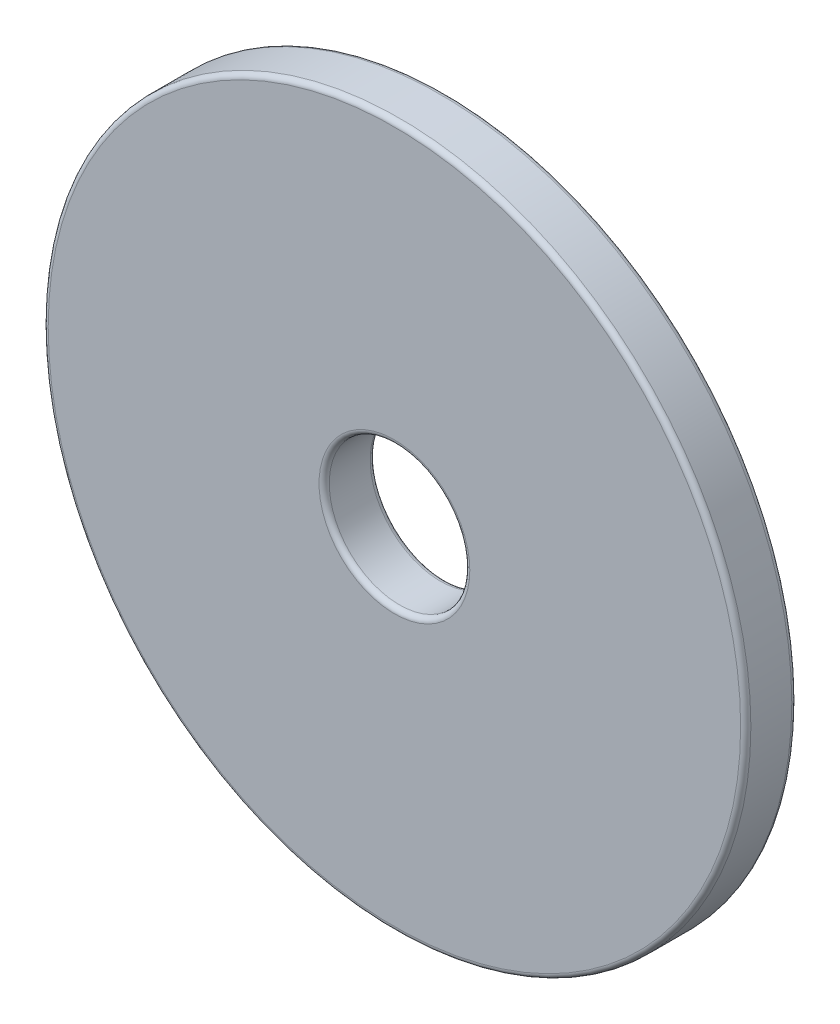
ISO-10303-21;
HEADER;
FILE_DESCRIPTION(('STEP AP214'),'2;1');
FILE_NAME('part.step','',(''),(''),'','','');
FILE_SCHEMA(('AUTOMOTIVE_DESIGN { 1 0 10303 214 1 1 1 1 }'));
ENDSEC;
DATA;
#1=APPLICATION_CONTEXT('core data for automotive mechanical design processes');
#2=APPLICATION_PROTOCOL_DEFINITION('international standard','automotive_design',2000,#1);
#3=PRODUCT_CONTEXT('',#1,'mechanical');
#4=PRODUCT('Part','Part','',(#3));
#5=PRODUCT_RELATED_PRODUCT_CATEGORY('part','',(#4));
#6=PRODUCT_DEFINITION_FORMATION('','',#4);
#7=PRODUCT_DEFINITION_CONTEXT('part definition',#1,'design');
#8=PRODUCT_DEFINITION('design','',#6,#7);
#9=PRODUCT_DEFINITION_SHAPE('','',#8);
#10=(LENGTH_UNIT() NAMED_UNIT(*) SI_UNIT(.MILLI.,.METRE.));
#11=(NAMED_UNIT(*) PLANE_ANGLE_UNIT() SI_UNIT($,.RADIAN.));
#12=(NAMED_UNIT(*) SI_UNIT($,.STERADIAN.) SOLID_ANGLE_UNIT());
#13=UNCERTAINTY_MEASURE_WITH_UNIT(LENGTH_MEASURE(1.E-05),#10,'distance_accuracy_value','');
#14=(GEOMETRIC_REPRESENTATION_CONTEXT(3) GLOBAL_UNCERTAINTY_ASSIGNED_CONTEXT((#13)) GLOBAL_UNIT_ASSIGNED_CONTEXT((#10,
#11,#12)) REPRESENTATION_CONTEXT('',''));
#15=CARTESIAN_POINT('',(0.,0.,0.));
#16=DIRECTION('',(0.,0.,1.));
#17=DIRECTION('',(1.,0.,0.));
#18=AXIS2_PLACEMENT_3D('',#15,#16,#17);
#19=CARTESIAN_POINT('',(0.,0.,-0.57785));
#20=DIRECTION('',(0.,0.,1.));
#21=DIRECTION('',(1.,0.,0.));
#22=AXIS2_PLACEMENT_3D('',#19,#20,#21);
#23=CYLINDRICAL_SURFACE('',#22,7.9375);
#24=CARTESIAN_POINT('',(0.,0.,0.46228));
#25=DIRECTION('',(0.,0.,1.));
#26=DIRECTION('',(1.,0.,0.));
#27=AXIS2_PLACEMENT_3D('',#24,#25,#26);
#28=CIRCLE('',#27,7.9375);
#29=CARTESIAN_POINT('',(7.9375,0.,0.46228));
#30=VERTEX_POINT('',#29);
#31=EDGE_CURVE('E10',#30,#30,#28,.F.);
#32=ORIENTED_EDGE('',*,*,#31,.T.);
#33=EDGE_LOOP('',(#32));
#34=FACE_BOUND('',#33,.T.);
#35=CARTESIAN_POINT('',(0.,0.,-0.46228));
#36=DIRECTION('',(0.,0.,1.));
#37=DIRECTION('',(1.,0.,0.));
#38=AXIS2_PLACEMENT_3D('',#35,#36,#37);
#39=CIRCLE('',#38,7.9375);
#40=CARTESIAN_POINT('',(7.9375,0.,-0.46228));
#41=VERTEX_POINT('',#40);
#42=EDGE_CURVE('E44',#41,#41,#39,.T.);
#43=ORIENTED_EDGE('',*,*,#42,.T.);
#44=EDGE_LOOP('',(#43));
#45=FACE_BOUND('',#44,.T.);
#46=ADVANCED_FACE('F37',(#34,#45),#23,.T.);
#47=CARTESIAN_POINT('',(0.,0.,-0.57785));
#48=DIRECTION('',(0.,0.,1.));
#49=DIRECTION('',(1.,0.,0.));
#50=AXIS2_PLACEMENT_3D('',#47,#48,#49);
#51=PLANE('',#50);
#52=CARTESIAN_POINT('',(0.,0.,-0.57785));
#53=DIRECTION('',(0.,0.,1.));
#54=DIRECTION('',(1.,0.,0.));
#55=AXIS2_PLACEMENT_3D('',#52,#53,#54);
#56=CIRCLE('',#55,1.70307);
#57=CARTESIAN_POINT('',(1.70307,0.,-0.57785));
#58=VERTEX_POINT('',#57);
#59=EDGE_CURVE('E48',#58,#58,#56,.T.);
#60=ORIENTED_EDGE('',*,*,#59,.T.);
#61=EDGE_LOOP('',(#60));
#62=FACE_BOUND('',#61,.T.);
#63=CARTESIAN_POINT('',(0.,0.,-0.57785));
#64=DIRECTION('',(0.,0.,1.));
#65=DIRECTION('',(1.,0.,0.));
#66=AXIS2_PLACEMENT_3D('',#63,#64,#65);
#67=CIRCLE('',#66,7.82193);
#68=CARTESIAN_POINT('',(7.82193,0.,-0.57785));
#69=VERTEX_POINT('',#68);
#70=EDGE_CURVE('E52',#69,#69,#67,.F.);
#71=ORIENTED_EDGE('',*,*,#70,.T.);
#72=EDGE_LOOP('',(#71));
#73=FACE_BOUND('',#72,.T.);
#74=ADVANCED_FACE('F80',(#62,#73),#51,.F.);
#75=CARTESIAN_POINT('',(0.,0.,0.57785));
#76=DIRECTION('',(0.,0.,1.));
#77=DIRECTION('',(1.,0.,0.));
#78=AXIS2_PLACEMENT_3D('',#75,#76,#77);
#79=PLANE('',#78);
#80=CARTESIAN_POINT('',(0.,0.,0.57785));
#81=DIRECTION('',(0.,0.,1.));
#82=DIRECTION('',(1.,0.,0.));
#83=AXIS2_PLACEMENT_3D('',#80,#81,#82);
#84=CIRCLE('',#83,1.70307);
#85=CARTESIAN_POINT('',(1.70307,0.,0.57785));
#86=VERTEX_POINT('',#85);
#87=EDGE_CURVE('E57',#86,#86,#84,.F.);
#88=ORIENTED_EDGE('',*,*,#87,.T.);
#89=EDGE_LOOP('',(#88));
#90=FACE_BOUND('',#89,.T.);
#91=CARTESIAN_POINT('',(0.,0.,0.57785));
#92=DIRECTION('',(0.,0.,1.));
#93=DIRECTION('',(1.,0.,0.));
#94=AXIS2_PLACEMENT_3D('',#91,#92,#93);
#95=CIRCLE('',#94,7.82193);
#96=CARTESIAN_POINT('',(7.82193,0.,0.57785));
#97=VERTEX_POINT('',#96);
#98=EDGE_CURVE('E60',#97,#97,#95,.T.);
#99=ORIENTED_EDGE('',*,*,#98,.T.);
#100=EDGE_LOOP('',(#99));
#101=FACE_BOUND('',#100,.T.);
#102=ADVANCED_FACE('F83',(#90,#101),#79,.T.);
#103=CARTESIAN_POINT('',(0.,0.,-0.57785));
#104=DIRECTION('',(0.,0.,1.));
#105=DIRECTION('',(1.,0.,0.));
#106=AXIS2_PLACEMENT_3D('',#103,#104,#105);
#107=CYLINDRICAL_SURFACE('',#106,1.5875);
#108=CARTESIAN_POINT('',(0.,0.,0.46228));
#109=DIRECTION('',(0.,0.,1.));
#110=DIRECTION('',(1.,0.,0.));
#111=AXIS2_PLACEMENT_3D('',#108,#109,#110);
#112=CIRCLE('',#111,1.5875);
#113=CARTESIAN_POINT('',(1.5875,0.,0.46228));
#114=VERTEX_POINT('',#113);
#115=EDGE_CURVE('E63',#114,#114,#112,.T.);
#116=ORIENTED_EDGE('',*,*,#115,.T.);
#117=EDGE_LOOP('',(#116));
#118=FACE_BOUND('',#117,.T.);
#119=CARTESIAN_POINT('',(0.,0.,-0.46228));
#120=DIRECTION('',(0.,0.,1.));
#121=DIRECTION('',(1.,0.,0.));
#122=AXIS2_PLACEMENT_3D('',#119,#120,#121);
#123=CIRCLE('',#122,1.5875);
#124=CARTESIAN_POINT('',(1.5875,0.,-0.46228));
#125=VERTEX_POINT('',#124);
#126=EDGE_CURVE('E66',#125,#125,#123,.F.);
#127=ORIENTED_EDGE('',*,*,#126,.T.);
#128=EDGE_LOOP('',(#127));
#129=FACE_BOUND('',#128,.T.);
#130=ADVANCED_FACE('F70',(#118,#129),#107,.F.);
#131=CARTESIAN_POINT('',(0.,0.,0.46228));
#132=DIRECTION('',(0.,0.,1.));
#133=DIRECTION('',(1.,0.,0.));
#134=AXIS2_PLACEMENT_3D('',#131,#132,#133);
#135=TOROIDAL_SURFACE('',#134,1.70307,0.11557);
#136=ORIENTED_EDGE('',*,*,#87,.F.);
#137=EDGE_LOOP('',(#136));
#138=FACE_BOUND('',#137,.T.);
#139=ORIENTED_EDGE('',*,*,#115,.F.);
#140=EDGE_LOOP('',(#139));
#141=FACE_BOUND('',#140,.T.);
#142=ADVANCED_FACE('F76',(#138,#141),#135,.T.);
#143=CARTESIAN_POINT('',(0.,0.,-0.46228));
#144=DIRECTION('',(0.,0.,1.));
#145=DIRECTION('',(1.,0.,0.));
#146=AXIS2_PLACEMENT_3D('',#143,#144,#145);
#147=TOROIDAL_SURFACE('',#146,1.70307,0.11557);
#148=ORIENTED_EDGE('',*,*,#126,.F.);
#149=EDGE_LOOP('',(#148));
#150=FACE_BOUND('',#149,.T.);
#151=ORIENTED_EDGE('',*,*,#59,.F.);
#152=EDGE_LOOP('',(#151));
#153=FACE_BOUND('',#152,.T.);
#154=ADVANCED_FACE('F72',(#150,#153),#147,.T.);
#155=CARTESIAN_POINT('',(0.,0.,0.46228));
#156=DIRECTION('',(0.,0.,1.));
#157=DIRECTION('',(1.,0.,0.));
#158=AXIS2_PLACEMENT_3D('',#155,#156,#157);
#159=TOROIDAL_SURFACE('',#158,7.82193,0.11557);
#160=ORIENTED_EDGE('',*,*,#31,.F.);
#161=EDGE_LOOP('',(#160));
#162=FACE_BOUND('',#161,.T.);
#163=ORIENTED_EDGE('',*,*,#98,.F.);
#164=EDGE_LOOP('',(#163));
#165=FACE_BOUND('',#164,.T.);
#166=ADVANCED_FACE('F75',(#162,#165),#159,.T.);
#167=CARTESIAN_POINT('',(0.,0.,-0.46228));
#168=DIRECTION('',(0.,0.,1.));
#169=DIRECTION('',(1.,0.,0.));
#170=AXIS2_PLACEMENT_3D('',#167,#168,#169);
#171=TOROIDAL_SURFACE('',#170,7.82193,0.11557);
#172=ORIENTED_EDGE('',*,*,#70,.F.);
#173=EDGE_LOOP('',(#172));
#174=FACE_BOUND('',#173,.T.);
#175=ORIENTED_EDGE('',*,*,#42,.F.);
#176=EDGE_LOOP('',(#175));
#177=FACE_BOUND('',#176,.T.);
#178=ADVANCED_FACE('F39',(#174,#177),#171,.T.);
#179=CLOSED_SHELL('',(#46,#74,#102,#130,#142,#154,#166,#178));
#180=MANIFOLD_SOLID_BREP('B2',#179);
#181=ADVANCED_BREP_SHAPE_REPRESENTATION('',(#18,#180),#14);
#182=SHAPE_DEFINITION_REPRESENTATION(#9,#181);
ENDSEC;
END-ISO-10303-21;
